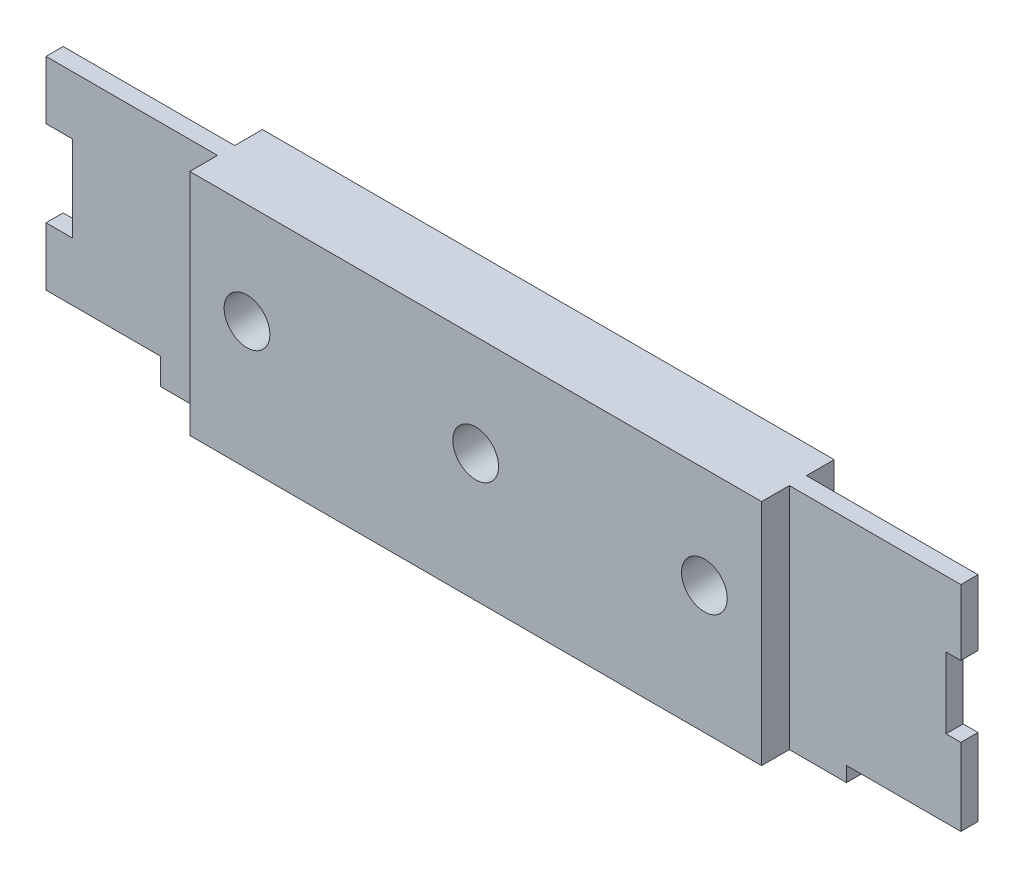
ISO-10303-21;
HEADER;
FILE_DESCRIPTION(('STEP AP214'),'2;1');
FILE_NAME('part.step','',(''),(''),'','','');
FILE_SCHEMA(('AUTOMOTIVE_DESIGN { 1 0 10303 214 1 1 1 1 }'));
ENDSEC;
DATA;
#1=APPLICATION_CONTEXT('core data for automotive mechanical design processes');
#2=APPLICATION_PROTOCOL_DEFINITION('international standard','automotive_design',2000,#1);
#3=PRODUCT_CONTEXT('',#1,'mechanical');
#4=PRODUCT('Part','Part','',(#3));
#5=PRODUCT_RELATED_PRODUCT_CATEGORY('part','',(#4));
#6=PRODUCT_DEFINITION_FORMATION('','',#4);
#7=PRODUCT_DEFINITION_CONTEXT('part definition',#1,'design');
#8=PRODUCT_DEFINITION('design','',#6,#7);
#9=PRODUCT_DEFINITION_SHAPE('','',#8);
#10=(LENGTH_UNIT() NAMED_UNIT(*) SI_UNIT(.MILLI.,.METRE.));
#11=(NAMED_UNIT(*) PLANE_ANGLE_UNIT() SI_UNIT($,.RADIAN.));
#12=(NAMED_UNIT(*) SI_UNIT($,.STERADIAN.) SOLID_ANGLE_UNIT());
#13=UNCERTAINTY_MEASURE_WITH_UNIT(LENGTH_MEASURE(1.E-05),#10,'distance_accuracy_value','');
#14=(GEOMETRIC_REPRESENTATION_CONTEXT(3) GLOBAL_UNCERTAINTY_ASSIGNED_CONTEXT((#13)) GLOBAL_UNIT_ASSIGNED_CONTEXT((#10,
#11,#12)) REPRESENTATION_CONTEXT('',''));
#15=CARTESIAN_POINT('',(0.,0.,0.));
#16=DIRECTION('',(0.,0.,1.));
#17=DIRECTION('',(1.,0.,0.));
#18=AXIS2_PLACEMENT_3D('',#15,#16,#17);
#19=CARTESIAN_POINT('',(0.,0.,0.75));
#20=DIRECTION('',(0.,0.,-1.));
#21=DIRECTION('',(-1.,0.,0.));
#22=AXIS2_PLACEMENT_3D('',#19,#20,#21);
#23=PLANE('',#22);
#24=DIRECTION('',(0.,-1.,0.));
#25=VECTOR('',#24,1.);
#26=CARTESIAN_POINT('',(-25.0000000000001,0.,0.75));
#27=LINE('',#26,#25);
#28=CARTESIAN_POINT('',(-25.0000000000001,8.84999999999999,0.75));
#29=VERTEX_POINT('',#28);
#30=CARTESIAN_POINT('',(-25.0000000000001,-11.15,0.75));
#31=VERTEX_POINT('',#30);
#32=EDGE_CURVE('E218',#29,#31,#27,.T.);
#33=ORIENTED_EDGE('',*,*,#32,.F.);
#34=DIRECTION('',(-1.,0.,0.));
#35=VECTOR('',#34,1.);
#36=CARTESIAN_POINT('',(-40.0000000000001,8.84999999999999,0.75));
#37=LINE('',#36,#35);
#38=CARTESIAN_POINT('',(-40.0000000000001,8.84999999999999,0.75));
#39=VERTEX_POINT('',#38);
#40=EDGE_CURVE('E265',#29,#39,#37,.T.);
#41=ORIENTED_EDGE('',*,*,#40,.T.);
#42=DIRECTION('',(0.,-1.,0.));
#43=VECTOR('',#42,1.);
#44=CARTESIAN_POINT('',(-40.,3.74999999999999,0.75));
#45=LINE('',#44,#43);
#46=CARTESIAN_POINT('',(-40.,3.74999999999999,0.75));
#47=VERTEX_POINT('',#46);
#48=EDGE_CURVE('E233',#39,#47,#45,.T.);
#49=ORIENTED_EDGE('',*,*,#48,.T.);
#50=DIRECTION('',(1.,0.,0.));
#51=VECTOR('',#50,1.);
#52=CARTESIAN_POINT('',(-37.7,3.74999999999999,0.75));
#53=LINE('',#52,#51);
#54=CARTESIAN_POINT('',(-37.7,3.74999999999999,0.75));
#55=VERTEX_POINT('',#54);
#56=EDGE_CURVE('E236',#47,#55,#53,.T.);
#57=ORIENTED_EDGE('',*,*,#56,.T.);
#58=DIRECTION('',(0.,-1.,0.));
#59=VECTOR('',#58,1.);
#60=CARTESIAN_POINT('',(-37.7,-3.75000000000001,0.75));
#61=LINE('',#60,#59);
#62=CARTESIAN_POINT('',(-37.7,-3.75000000000001,0.75));
#63=VERTEX_POINT('',#62);
#64=EDGE_CURVE('E239',#55,#63,#61,.T.);
#65=ORIENTED_EDGE('',*,*,#64,.T.);
#66=DIRECTION('',(-1.,0.,0.));
#67=VECTOR('',#66,1.);
#68=CARTESIAN_POINT('',(-40.,-3.75000000000001,0.75));
#69=LINE('',#68,#67);
#70=CARTESIAN_POINT('',(-40.,-3.75000000000001,0.75));
#71=VERTEX_POINT('',#70);
#72=EDGE_CURVE('E241',#63,#71,#69,.T.);
#73=ORIENTED_EDGE('',*,*,#72,.T.);
#74=DIRECTION('',(0.,-1.,0.));
#75=VECTOR('',#74,1.);
#76=CARTESIAN_POINT('',(-40.,-8.85000000000001,0.75));
#77=LINE('',#76,#75);
#78=CARTESIAN_POINT('',(-40.,-8.85000000000001,0.75));
#79=VERTEX_POINT('',#78);
#80=EDGE_CURVE('E243',#71,#79,#77,.T.);
#81=ORIENTED_EDGE('',*,*,#80,.T.);
#82=DIRECTION('',(1.,0.,0.));
#83=VECTOR('',#82,1.);
#84=CARTESIAN_POINT('',(-30.,-8.85,0.75));
#85=LINE('',#84,#83);
#86=CARTESIAN_POINT('',(-30.,-8.85,0.75));
#87=VERTEX_POINT('',#86);
#88=EDGE_CURVE('E245',#79,#87,#85,.T.);
#89=ORIENTED_EDGE('',*,*,#88,.T.);
#90=DIRECTION('',(0.,-1.,0.));
#91=VECTOR('',#90,1.);
#92=CARTESIAN_POINT('',(-30.,-11.15,0.75));
#93=LINE('',#92,#91);
#94=CARTESIAN_POINT('',(-30.,-11.15,0.75));
#95=VERTEX_POINT('',#94);
#96=EDGE_CURVE('E247',#87,#95,#93,.T.);
#97=ORIENTED_EDGE('',*,*,#96,.T.);
#98=DIRECTION('',(1.,0.,0.));
#99=VECTOR('',#98,1.);
#100=CARTESIAN_POINT('',(30.,-11.15,0.75));
#101=LINE('',#100,#99);
#102=EDGE_CURVE('E56',#95,#31,#101,.T.);
#103=ORIENTED_EDGE('',*,*,#102,.T.);
#104=EDGE_LOOP('',(#33,#41,#49,#57,#65,#73,#81,#89,#97,#103));
#105=FACE_BOUND('',#104,.T.);
#106=ADVANCED_FACE('F33',(#105),#23,.F.);
#107=DIRECTION('',(0.,1.,0.));
#108=VECTOR('',#107,1.);
#109=CARTESIAN_POINT('',(25.,0.,0.75));
#110=LINE('',#109,#108);
#111=CARTESIAN_POINT('',(25.,-11.15,0.75));
#112=VERTEX_POINT('',#111);
#113=CARTESIAN_POINT('',(25.,8.84999999999999,0.75));
#114=VERTEX_POINT('',#113);
#115=EDGE_CURVE('E48',#112,#114,#110,.T.);
#116=ORIENTED_EDGE('',*,*,#115,.F.);
#117=CARTESIAN_POINT('',(30.,-11.15,0.75));
#118=VERTEX_POINT('',#117);
#119=EDGE_CURVE('E249',#112,#118,#101,.T.);
#120=ORIENTED_EDGE('',*,*,#119,.T.);
#121=DIRECTION('',(0.,1.,0.));
#122=VECTOR('',#121,1.);
#123=CARTESIAN_POINT('',(30.,-9.84999999999999,0.75));
#124=LINE('',#123,#122);
#125=CARTESIAN_POINT('',(30.,-9.84999999999999,0.75));
#126=VERTEX_POINT('',#125);
#127=EDGE_CURVE('E251',#118,#126,#124,.T.);
#128=ORIENTED_EDGE('',*,*,#127,.T.);
#129=DIRECTION('',(1.,0.,0.));
#130=VECTOR('',#129,1.);
#131=CARTESIAN_POINT('',(40.,-9.84999999999999,0.75));
#132=LINE('',#131,#130);
#133=CARTESIAN_POINT('',(40.,-9.84999999999999,0.75));
#134=VERTEX_POINT('',#133);
#135=EDGE_CURVE('E253',#126,#134,#132,.T.);
#136=ORIENTED_EDGE('',*,*,#135,.T.);
#137=DIRECTION('',(0.,1.,0.));
#138=VECTOR('',#137,1.);
#139=CARTESIAN_POINT('',(40.,-3.1,0.75));
#140=LINE('',#139,#138);
#141=CARTESIAN_POINT('',(40.,-3.1,0.75));
#142=VERTEX_POINT('',#141);
#143=EDGE_CURVE('E255',#134,#142,#140,.T.);
#144=ORIENTED_EDGE('',*,*,#143,.T.);
#145=DIRECTION('',(-1.,0.,0.));
#146=VECTOR('',#145,1.);
#147=CARTESIAN_POINT('',(38.7,-3.1,0.75));
#148=LINE('',#147,#146);
#149=CARTESIAN_POINT('',(38.7,-3.1,0.75));
#150=VERTEX_POINT('',#149);
#151=EDGE_CURVE('E257',#142,#150,#148,.T.);
#152=ORIENTED_EDGE('',*,*,#151,.T.);
#153=DIRECTION('',(0.,1.,0.));
#154=VECTOR('',#153,1.);
#155=CARTESIAN_POINT('',(38.7,3.1,0.75));
#156=LINE('',#155,#154);
#157=CARTESIAN_POINT('',(38.7,3.1,0.75));
#158=VERTEX_POINT('',#157);
#159=EDGE_CURVE('E259',#150,#158,#156,.T.);
#160=ORIENTED_EDGE('',*,*,#159,.T.);
#161=DIRECTION('',(1.,0.,0.));
#162=VECTOR('',#161,1.);
#163=CARTESIAN_POINT('',(40.,3.1,0.75));
#164=LINE('',#163,#162);
#165=CARTESIAN_POINT('',(40.,3.1,0.75));
#166=VERTEX_POINT('',#165);
#167=EDGE_CURVE('E261',#158,#166,#164,.T.);
#168=ORIENTED_EDGE('',*,*,#167,.T.);
#169=DIRECTION('',(0.,1.,0.));
#170=VECTOR('',#169,1.);
#171=CARTESIAN_POINT('',(40.0000000000001,8.84999999999999,0.75));
#172=LINE('',#171,#170);
#173=CARTESIAN_POINT('',(40.0000000000001,8.84999999999999,0.75));
#174=VERTEX_POINT('',#173);
#175=EDGE_CURVE('E263',#166,#174,#172,.T.);
#176=ORIENTED_EDGE('',*,*,#175,.T.);
#177=EDGE_CURVE('E266',#174,#114,#37,.T.);
#178=ORIENTED_EDGE('',*,*,#177,.T.);
#179=EDGE_LOOP('',(#116,#120,#128,#136,#144,#152,#160,#168,#176,#178));
#180=FACE_BOUND('',#179,.T.);
#181=ADVANCED_FACE('F429',(#180),#23,.F.);
#182=CARTESIAN_POINT('',(0.,0.,-0.75));
#183=DIRECTION('',(0.,0.,-1.));
#184=DIRECTION('',(-1.,0.,0.));
#185=AXIS2_PLACEMENT_3D('',#182,#183,#184);
#186=PLANE('',#185);
#187=DIRECTION('',(-1.,0.,0.));
#188=VECTOR('',#187,1.);
#189=CARTESIAN_POINT('',(-40.0000000000001,8.84999999999999,-0.75));
#190=LINE('',#189,#188);
#191=CARTESIAN_POINT('',(-25.0000000000001,8.84999999999999,-0.75));
#192=VERTEX_POINT('',#191);
#193=CARTESIAN_POINT('',(-40.0000000000001,8.84999999999999,-0.75));
#194=VERTEX_POINT('',#193);
#195=EDGE_CURVE('E301',#192,#194,#190,.T.);
#196=ORIENTED_EDGE('',*,*,#195,.F.);
#197=DIRECTION('',(0.,-1.,0.));
#198=VECTOR('',#197,1.);
#199=CARTESIAN_POINT('',(-25.0000000000001,0.,-0.75));
#200=LINE('',#199,#198);
#201=CARTESIAN_POINT('',(-25.0000000000001,-11.15,-0.75));
#202=VERTEX_POINT('',#201);
#203=EDGE_CURVE('E228',#192,#202,#200,.T.);
#204=ORIENTED_EDGE('',*,*,#203,.T.);
#205=DIRECTION('',(1.,0.,0.));
#206=VECTOR('',#205,1.);
#207=CARTESIAN_POINT('',(30.,-11.15,-0.75));
#208=LINE('',#207,#206);
#209=CARTESIAN_POINT('',(-30.,-11.15,-0.75));
#210=VERTEX_POINT('',#209);
#211=EDGE_CURVE('E284',#210,#202,#208,.T.);
#212=ORIENTED_EDGE('',*,*,#211,.F.);
#213=DIRECTION('',(0.,-1.,0.));
#214=VECTOR('',#213,1.);
#215=CARTESIAN_POINT('',(-30.,-11.15,-0.75));
#216=LINE('',#215,#214);
#217=CARTESIAN_POINT('',(-30.,-8.85,-0.75));
#218=VERTEX_POINT('',#217);
#219=EDGE_CURVE('E281',#218,#210,#216,.T.);
#220=ORIENTED_EDGE('',*,*,#219,.F.);
#221=DIRECTION('',(1.,0.,0.));
#222=VECTOR('',#221,1.);
#223=CARTESIAN_POINT('',(-30.,-8.85,-0.75));
#224=LINE('',#223,#222);
#225=CARTESIAN_POINT('',(-40.,-8.85000000000001,-0.75));
#226=VERTEX_POINT('',#225);
#227=EDGE_CURVE('E279',#226,#218,#224,.T.);
#228=ORIENTED_EDGE('',*,*,#227,.F.);
#229=DIRECTION('',(0.,-1.,0.));
#230=VECTOR('',#229,1.);
#231=CARTESIAN_POINT('',(-40.,-8.85000000000001,-0.75));
#232=LINE('',#231,#230);
#233=CARTESIAN_POINT('',(-40.,-3.75000000000001,-0.75));
#234=VERTEX_POINT('',#233);
#235=EDGE_CURVE('E277',#234,#226,#232,.T.);
#236=ORIENTED_EDGE('',*,*,#235,.F.);
#237=DIRECTION('',(-1.,0.,0.));
#238=VECTOR('',#237,1.);
#239=CARTESIAN_POINT('',(-40.,-3.75000000000001,-0.75));
#240=LINE('',#239,#238);
#241=CARTESIAN_POINT('',(-37.7,-3.75000000000001,-0.75));
#242=VERTEX_POINT('',#241);
#243=EDGE_CURVE('E275',#242,#234,#240,.T.);
#244=ORIENTED_EDGE('',*,*,#243,.F.);
#245=DIRECTION('',(0.,-1.,0.));
#246=VECTOR('',#245,1.);
#247=CARTESIAN_POINT('',(-37.7,-3.75000000000001,-0.75));
#248=LINE('',#247,#246);
#249=CARTESIAN_POINT('',(-37.7,3.74999999999999,-0.75));
#250=VERTEX_POINT('',#249);
#251=EDGE_CURVE('E273',#250,#242,#248,.T.);
#252=ORIENTED_EDGE('',*,*,#251,.F.);
#253=DIRECTION('',(1.,0.,0.));
#254=VECTOR('',#253,1.);
#255=CARTESIAN_POINT('',(-37.7,3.74999999999999,-0.75));
#256=LINE('',#255,#254);
#257=CARTESIAN_POINT('',(-40.,3.74999999999999,-0.75));
#258=VERTEX_POINT('',#257);
#259=EDGE_CURVE('E271',#258,#250,#256,.T.);
#260=ORIENTED_EDGE('',*,*,#259,.F.);
#261=DIRECTION('',(0.,-1.,0.));
#262=VECTOR('',#261,1.);
#263=CARTESIAN_POINT('',(-40.,3.74999999999999,-0.75));
#264=LINE('',#263,#262);
#265=EDGE_CURVE('E232',#194,#258,#264,.T.);
#266=ORIENTED_EDGE('',*,*,#265,.F.);
#267=EDGE_LOOP('',(#196,#204,#212,#220,#228,#236,#244,#252,#260,#266));
#268=FACE_BOUND('',#267,.T.);
#269=ADVANCED_FACE('F355',(#268),#186,.T.);
#270=CARTESIAN_POINT('',(25.,-11.15,-0.75));
#271=VERTEX_POINT('',#270);
#272=CARTESIAN_POINT('',(30.,-11.15,-0.75));
#273=VERTEX_POINT('',#272);
#274=EDGE_CURVE('E283',#271,#273,#208,.T.);
#275=ORIENTED_EDGE('',*,*,#274,.F.);
#276=DIRECTION('',(0.,1.,0.));
#277=VECTOR('',#276,1.);
#278=CARTESIAN_POINT('',(25.,0.,-0.75));
#279=LINE('',#278,#277);
#280=CARTESIAN_POINT('',(25.,8.84999999999999,-0.75));
#281=VERTEX_POINT('',#280);
#282=EDGE_CURVE('E219',#271,#281,#279,.T.);
#283=ORIENTED_EDGE('',*,*,#282,.T.);
#284=CARTESIAN_POINT('',(40.0000000000001,8.84999999999999,-0.75));
#285=VERTEX_POINT('',#284);
#286=EDGE_CURVE('E237',#285,#281,#190,.T.);
#287=ORIENTED_EDGE('',*,*,#286,.F.);
#288=DIRECTION('',(0.,1.,0.));
#289=VECTOR('',#288,1.);
#290=CARTESIAN_POINT('',(40.0000000000001,8.84999999999999,-0.75));
#291=LINE('',#290,#289);
#292=CARTESIAN_POINT('',(40.,3.1,-0.75));
#293=VERTEX_POINT('',#292);
#294=EDGE_CURVE('E299',#293,#285,#291,.T.);
#295=ORIENTED_EDGE('',*,*,#294,.F.);
#296=DIRECTION('',(1.,0.,0.));
#297=VECTOR('',#296,1.);
#298=CARTESIAN_POINT('',(40.,3.1,-0.75));
#299=LINE('',#298,#297);
#300=CARTESIAN_POINT('',(38.7,3.1,-0.75));
#301=VERTEX_POINT('',#300);
#302=EDGE_CURVE('E297',#301,#293,#299,.T.);
#303=ORIENTED_EDGE('',*,*,#302,.F.);
#304=DIRECTION('',(0.,1.,0.));
#305=VECTOR('',#304,1.);
#306=CARTESIAN_POINT('',(38.7,3.1,-0.75));
#307=LINE('',#306,#305);
#308=CARTESIAN_POINT('',(38.7,-3.1,-0.75));
#309=VERTEX_POINT('',#308);
#310=EDGE_CURVE('E295',#309,#301,#307,.T.);
#311=ORIENTED_EDGE('',*,*,#310,.F.);
#312=DIRECTION('',(-1.,0.,0.));
#313=VECTOR('',#312,1.);
#314=CARTESIAN_POINT('',(38.7,-3.1,-0.75));
#315=LINE('',#314,#313);
#316=CARTESIAN_POINT('',(40.,-3.1,-0.75));
#317=VERTEX_POINT('',#316);
#318=EDGE_CURVE('E293',#317,#309,#315,.T.);
#319=ORIENTED_EDGE('',*,*,#318,.F.);
#320=DIRECTION('',(0.,1.,0.));
#321=VECTOR('',#320,1.);
#322=CARTESIAN_POINT('',(40.,-3.1,-0.75));
#323=LINE('',#322,#321);
#324=CARTESIAN_POINT('',(40.,-9.84999999999999,-0.75));
#325=VERTEX_POINT('',#324);
#326=EDGE_CURVE('E291',#325,#317,#323,.T.);
#327=ORIENTED_EDGE('',*,*,#326,.F.);
#328=DIRECTION('',(1.,0.,0.));
#329=VECTOR('',#328,1.);
#330=CARTESIAN_POINT('',(40.,-9.84999999999999,-0.75));
#331=LINE('',#330,#329);
#332=CARTESIAN_POINT('',(30.,-9.84999999999999,-0.75));
#333=VERTEX_POINT('',#332);
#334=EDGE_CURVE('E289',#333,#325,#331,.T.);
#335=ORIENTED_EDGE('',*,*,#334,.F.);
#336=DIRECTION('',(0.,1.,0.));
#337=VECTOR('',#336,1.);
#338=CARTESIAN_POINT('',(30.,-9.84999999999999,-0.75));
#339=LINE('',#338,#337);
#340=EDGE_CURVE('E287',#273,#333,#339,.T.);
#341=ORIENTED_EDGE('',*,*,#340,.F.);
#342=EDGE_LOOP('',(#275,#283,#287,#295,#303,#311,#319,#327,#335,#341));
#343=FACE_BOUND('',#342,.T.);
#344=ADVANCED_FACE('F417',(#343),#186,.T.);
#345=CARTESIAN_POINT('',(-40.,3.74999999999999,0.75));
#346=DIRECTION('',(1.,0.,0.));
#347=DIRECTION('',(0.,1.,0.));
#348=AXIS2_PLACEMENT_3D('',#345,#346,#347);
#349=PLANE('',#348);
#350=ORIENTED_EDGE('',*,*,#265,.T.);
#351=DIRECTION('',(0.,0.,-1.));
#352=VECTOR('',#351,1.);
#353=CARTESIAN_POINT('',(-40.,3.74999999999999,0.75));
#354=LINE('',#353,#352);
#355=EDGE_CURVE('E11',#47,#258,#354,.T.);
#356=ORIENTED_EDGE('',*,*,#355,.F.);
#357=ORIENTED_EDGE('',*,*,#48,.F.);
#358=DIRECTION('',(0.,0.,-1.));
#359=VECTOR('',#358,1.);
#360=CARTESIAN_POINT('',(-40.0000000000001,8.84999999999999,0.75));
#361=LINE('',#360,#359);
#362=EDGE_CURVE('E268',#39,#194,#361,.T.);
#363=ORIENTED_EDGE('',*,*,#362,.T.);
#364=EDGE_LOOP('',(#350,#356,#357,#363));
#365=FACE_BOUND('',#364,.T.);
#366=ADVANCED_FACE('F35',(#365),#349,.F.);
#367=CARTESIAN_POINT('',(-37.7,3.74999999999999,0.75));
#368=DIRECTION('',(0.,1.,0.));
#369=DIRECTION('',(-1.,0.,0.));
#370=AXIS2_PLACEMENT_3D('',#367,#368,#369);
#371=PLANE('',#370);
#372=ORIENTED_EDGE('',*,*,#259,.T.);
#373=DIRECTION('',(0.,0.,-1.));
#374=VECTOR('',#373,1.);
#375=CARTESIAN_POINT('',(-37.7,3.74999999999999,0.75));
#376=LINE('',#375,#374);
#377=EDGE_CURVE('E41',#55,#250,#376,.T.);
#378=ORIENTED_EDGE('',*,*,#377,.F.);
#379=ORIENTED_EDGE('',*,*,#56,.F.);
#380=ORIENTED_EDGE('',*,*,#355,.T.);
#381=EDGE_LOOP('',(#372,#378,#379,#380));
#382=FACE_BOUND('',#381,.T.);
#383=ADVANCED_FACE('F371',(#382),#371,.F.);
#384=CARTESIAN_POINT('',(-37.7,-3.75000000000001,0.75));
#385=DIRECTION('',(1.,0.,0.));
#386=DIRECTION('',(0.,1.,0.));
#387=AXIS2_PLACEMENT_3D('',#384,#385,#386);
#388=PLANE('',#387);
#389=ORIENTED_EDGE('',*,*,#251,.T.);
#390=DIRECTION('',(0.,0.,-1.));
#391=VECTOR('',#390,1.);
#392=CARTESIAN_POINT('',(-37.7,-3.75000000000001,0.75));
#393=LINE('',#392,#391);
#394=EDGE_CURVE('E342',#63,#242,#393,.T.);
#395=ORIENTED_EDGE('',*,*,#394,.F.);
#396=ORIENTED_EDGE('',*,*,#64,.F.);
#397=ORIENTED_EDGE('',*,*,#377,.T.);
#398=EDGE_LOOP('',(#389,#395,#396,#397));
#399=FACE_BOUND('',#398,.T.);
#400=ADVANCED_FACE('F349',(#399),#388,.F.);
#401=CARTESIAN_POINT('',(-40.,-3.75000000000001,0.75));
#402=DIRECTION('',(0.,-1.,0.));
#403=DIRECTION('',(0.,0.,-1.));
#404=AXIS2_PLACEMENT_3D('',#401,#402,#403);
#405=PLANE('',#404);
#406=ORIENTED_EDGE('',*,*,#243,.T.);
#407=DIRECTION('',(0.,0.,-1.));
#408=VECTOR('',#407,1.);
#409=CARTESIAN_POINT('',(-40.,-3.75000000000001,0.75));
#410=LINE('',#409,#408);
#411=EDGE_CURVE('E339',#71,#234,#410,.T.);
#412=ORIENTED_EDGE('',*,*,#411,.F.);
#413=ORIENTED_EDGE('',*,*,#72,.F.);
#414=ORIENTED_EDGE('',*,*,#394,.T.);
#415=EDGE_LOOP('',(#406,#412,#413,#414));
#416=FACE_BOUND('',#415,.T.);
#417=ADVANCED_FACE('F361',(#416),#405,.F.);
#418=CARTESIAN_POINT('',(-40.,-8.85000000000001,0.75));
#419=DIRECTION('',(1.,0.,0.));
#420=DIRECTION('',(0.,1.,0.));
#421=AXIS2_PLACEMENT_3D('',#418,#419,#420);
#422=PLANE('',#421);
#423=ORIENTED_EDGE('',*,*,#235,.T.);
#424=DIRECTION('',(0.,0.,-1.));
#425=VECTOR('',#424,1.);
#426=CARTESIAN_POINT('',(-40.,-8.85000000000001,0.75));
#427=LINE('',#426,#425);
#428=EDGE_CURVE('E336',#79,#226,#427,.T.);
#429=ORIENTED_EDGE('',*,*,#428,.F.);
#430=ORIENTED_EDGE('',*,*,#80,.F.);
#431=ORIENTED_EDGE('',*,*,#411,.T.);
#432=EDGE_LOOP('',(#423,#429,#430,#431));
#433=FACE_BOUND('',#432,.T.);
#434=ADVANCED_FACE('F365',(#433),#422,.F.);
#435=CARTESIAN_POINT('',(-30.,-8.85,0.75));
#436=DIRECTION('',(0.,1.,0.));
#437=DIRECTION('',(-1.,0.,0.));
#438=AXIS2_PLACEMENT_3D('',#435,#436,#437);
#439=PLANE('',#438);
#440=ORIENTED_EDGE('',*,*,#227,.T.);
#441=DIRECTION('',(0.,0.,-1.));
#442=VECTOR('',#441,1.);
#443=CARTESIAN_POINT('',(-30.,-8.85,0.75));
#444=LINE('',#443,#442);
#445=EDGE_CURVE('E333',#87,#218,#444,.T.);
#446=ORIENTED_EDGE('',*,*,#445,.F.);
#447=ORIENTED_EDGE('',*,*,#88,.F.);
#448=ORIENTED_EDGE('',*,*,#428,.T.);
#449=EDGE_LOOP('',(#440,#446,#447,#448));
#450=FACE_BOUND('',#449,.T.);
#451=ADVANCED_FACE('F505',(#450),#439,.F.);
#452=CARTESIAN_POINT('',(-30.,-11.15,0.75));
#453=DIRECTION('',(1.,0.,0.));
#454=DIRECTION('',(0.,1.,0.));
#455=AXIS2_PLACEMENT_3D('',#452,#453,#454);
#456=PLANE('',#455);
#457=ORIENTED_EDGE('',*,*,#219,.T.);
#458=DIRECTION('',(0.,0.,-1.));
#459=VECTOR('',#458,1.);
#460=CARTESIAN_POINT('',(-30.,-11.15,0.75));
#461=LINE('',#460,#459);
#462=EDGE_CURVE('E330',#95,#210,#461,.T.);
#463=ORIENTED_EDGE('',*,*,#462,.F.);
#464=ORIENTED_EDGE('',*,*,#96,.F.);
#465=ORIENTED_EDGE('',*,*,#445,.T.);
#466=EDGE_LOOP('',(#457,#463,#464,#465));
#467=FACE_BOUND('',#466,.T.);
#468=ADVANCED_FACE('F502',(#467),#456,.F.);
#469=CARTESIAN_POINT('',(30.,-11.15,0.75));
#470=DIRECTION('',(0.,1.,0.));
#471=DIRECTION('',(-1.,0.,0.));
#472=AXIS2_PLACEMENT_3D('',#469,#470,#471);
#473=PLANE('',#472);
#474=ORIENTED_EDGE('',*,*,#119,.F.);
#475=DIRECTION('',(0.,0.,-1.));
#476=VECTOR('',#475,1.);
#477=CARTESIAN_POINT('',(25.,-11.15,3.175));
#478=LINE('',#477,#476);
#479=CARTESIAN_POINT('',(25.,-11.15,3.175));
#480=VERTEX_POINT('',#479);
#481=EDGE_CURVE('E201',#480,#112,#478,.T.);
#482=ORIENTED_EDGE('',*,*,#481,.F.);
#483=DIRECTION('',(1.,0.,0.));
#484=VECTOR('',#483,1.);
#485=CARTESIAN_POINT('',(-25.0000000000001,-11.15,3.175));
#486=LINE('',#485,#484);
#487=CARTESIAN_POINT('',(-25.0000000000001,-11.15,3.175));
#488=VERTEX_POINT('',#487);
#489=EDGE_CURVE('E195',#488,#480,#486,.T.);
#490=ORIENTED_EDGE('',*,*,#489,.F.);
#491=DIRECTION('',(0.,0.,-1.));
#492=VECTOR('',#491,1.);
#493=CARTESIAN_POINT('',(-25.0000000000001,-11.15,3.175));
#494=LINE('',#493,#492);
#495=EDGE_CURVE('E199',#488,#31,#494,.T.);
#496=ORIENTED_EDGE('',*,*,#495,.T.);
#497=ORIENTED_EDGE('',*,*,#102,.F.);
#498=ORIENTED_EDGE('',*,*,#462,.T.);
#499=ORIENTED_EDGE('',*,*,#211,.T.);
#500=CARTESIAN_POINT('',(-25.0000000000001,-11.15,-3.175));
#501=VERTEX_POINT('',#500);
#502=EDGE_CURVE('E220',#202,#501,#494,.T.);
#503=ORIENTED_EDGE('',*,*,#502,.T.);
#504=DIRECTION('',(1.,0.,0.));
#505=VECTOR('',#504,1.);
#506=CARTESIAN_POINT('',(-25.0000000000001,-11.15,-3.175));
#507=LINE('',#506,#505);
#508=CARTESIAN_POINT('',(25.,-11.15,-3.175));
#509=VERTEX_POINT('',#508);
#510=EDGE_CURVE('E391',#501,#509,#507,.T.);
#511=ORIENTED_EDGE('',*,*,#510,.T.);
#512=EDGE_CURVE('E407',#271,#509,#478,.T.);
#513=ORIENTED_EDGE('',*,*,#512,.F.);
#514=ORIENTED_EDGE('',*,*,#274,.T.);
#515=DIRECTION('',(0.,0.,-1.));
#516=VECTOR('',#515,1.);
#517=CARTESIAN_POINT('',(30.,-11.15,0.75));
#518=LINE('',#517,#516);
#519=EDGE_CURVE('E327',#118,#273,#518,.T.);
#520=ORIENTED_EDGE('',*,*,#519,.F.);
#521=EDGE_LOOP('',(#474,#482,#490,#496,#497,#498,#499,#503,#511,#513,#514,#520));
#522=FACE_BOUND('',#521,.T.);
#523=ADVANCED_FACE('F197',(#522),#473,.F.);
#524=CARTESIAN_POINT('',(30.,-9.84999999999999,0.75));
#525=DIRECTION('',(-1.,0.,0.));
#526=DIRECTION('',(0.,-1.,0.));
#527=AXIS2_PLACEMENT_3D('',#524,#525,#526);
#528=PLANE('',#527);
#529=ORIENTED_EDGE('',*,*,#340,.T.);
#530=DIRECTION('',(0.,0.,-1.));
#531=VECTOR('',#530,1.);
#532=CARTESIAN_POINT('',(30.,-9.84999999999999,0.75));
#533=LINE('',#532,#531);
#534=EDGE_CURVE('E324',#126,#333,#533,.T.);
#535=ORIENTED_EDGE('',*,*,#534,.F.);
#536=ORIENTED_EDGE('',*,*,#127,.F.);
#537=ORIENTED_EDGE('',*,*,#519,.T.);
#538=EDGE_LOOP('',(#529,#535,#536,#537));
#539=FACE_BOUND('',#538,.T.);
#540=ADVANCED_FACE('F422',(#539),#528,.F.);
#541=CARTESIAN_POINT('',(40.,-9.84999999999999,0.75));
#542=DIRECTION('',(0.,1.,0.));
#543=DIRECTION('',(-1.,0.,0.));
#544=AXIS2_PLACEMENT_3D('',#541,#542,#543);
#545=PLANE('',#544);
#546=ORIENTED_EDGE('',*,*,#334,.T.);
#547=DIRECTION('',(0.,0.,-1.));
#548=VECTOR('',#547,1.);
#549=CARTESIAN_POINT('',(40.,-9.84999999999999,0.75));
#550=LINE('',#549,#548);
#551=EDGE_CURVE('E321',#134,#325,#550,.T.);
#552=ORIENTED_EDGE('',*,*,#551,.F.);
#553=ORIENTED_EDGE('',*,*,#135,.F.);
#554=ORIENTED_EDGE('',*,*,#534,.T.);
#555=EDGE_LOOP('',(#546,#552,#553,#554));
#556=FACE_BOUND('',#555,.T.);
#557=ADVANCED_FACE('F426',(#556),#545,.F.);
#558=CARTESIAN_POINT('',(40.,-3.1,0.75));
#559=DIRECTION('',(-1.,0.,0.));
#560=DIRECTION('',(0.,-1.,0.));
#561=AXIS2_PLACEMENT_3D('',#558,#559,#560);
#562=PLANE('',#561);
#563=ORIENTED_EDGE('',*,*,#326,.T.);
#564=DIRECTION('',(0.,0.,-1.));
#565=VECTOR('',#564,1.);
#566=CARTESIAN_POINT('',(40.,-3.1,0.75));
#567=LINE('',#566,#565);
#568=EDGE_CURVE('E318',#142,#317,#567,.T.);
#569=ORIENTED_EDGE('',*,*,#568,.F.);
#570=ORIENTED_EDGE('',*,*,#143,.F.);
#571=ORIENTED_EDGE('',*,*,#551,.T.);
#572=EDGE_LOOP('',(#563,#569,#570,#571));
#573=FACE_BOUND('',#572,.T.);
#574=ADVANCED_FACE('F491',(#573),#562,.F.);
#575=CARTESIAN_POINT('',(38.7,-3.1,0.75));
#576=DIRECTION('',(0.,-1.,0.));
#577=DIRECTION('',(0.,0.,-1.));
#578=AXIS2_PLACEMENT_3D('',#575,#576,#577);
#579=PLANE('',#578);
#580=ORIENTED_EDGE('',*,*,#318,.T.);
#581=DIRECTION('',(0.,0.,-1.));
#582=VECTOR('',#581,1.);
#583=CARTESIAN_POINT('',(38.7,-3.1,0.75));
#584=LINE('',#583,#582);
#585=EDGE_CURVE('E315',#150,#309,#584,.T.);
#586=ORIENTED_EDGE('',*,*,#585,.F.);
#587=ORIENTED_EDGE('',*,*,#151,.F.);
#588=ORIENTED_EDGE('',*,*,#568,.T.);
#589=EDGE_LOOP('',(#580,#586,#587,#588));
#590=FACE_BOUND('',#589,.T.);
#591=ADVANCED_FACE('F487',(#590),#579,.F.);
#592=CARTESIAN_POINT('',(38.7,3.1,0.75));
#593=DIRECTION('',(-1.,0.,0.));
#594=DIRECTION('',(0.,0.,1.));
#595=AXIS2_PLACEMENT_3D('',#592,#593,#594);
#596=PLANE('',#595);
#597=ORIENTED_EDGE('',*,*,#310,.T.);
#598=DIRECTION('',(0.,0.,-1.));
#599=VECTOR('',#598,1.);
#600=CARTESIAN_POINT('',(38.7,3.1,0.75));
#601=LINE('',#600,#599);
#602=EDGE_CURVE('E312',#158,#301,#601,.T.);
#603=ORIENTED_EDGE('',*,*,#602,.F.);
#604=ORIENTED_EDGE('',*,*,#159,.F.);
#605=ORIENTED_EDGE('',*,*,#585,.T.);
#606=EDGE_LOOP('',(#597,#603,#604,#605));
#607=FACE_BOUND('',#606,.T.);
#608=ADVANCED_FACE('F483',(#607),#596,.F.);
#609=CARTESIAN_POINT('',(40.,3.1,0.75));
#610=DIRECTION('',(0.,1.,0.));
#611=DIRECTION('',(0.,0.,1.));
#612=AXIS2_PLACEMENT_3D('',#609,#610,#611);
#613=PLANE('',#612);
#614=ORIENTED_EDGE('',*,*,#302,.T.);
#615=DIRECTION('',(0.,0.,-1.));
#616=VECTOR('',#615,1.);
#617=CARTESIAN_POINT('',(40.,3.1,0.75));
#618=LINE('',#617,#616);
#619=EDGE_CURVE('E309',#166,#293,#618,.T.);
#620=ORIENTED_EDGE('',*,*,#619,.F.);
#621=ORIENTED_EDGE('',*,*,#167,.F.);
#622=ORIENTED_EDGE('',*,*,#602,.T.);
#623=EDGE_LOOP('',(#614,#620,#621,#622));
#624=FACE_BOUND('',#623,.T.);
#625=ADVANCED_FACE('F479',(#624),#613,.F.);
#626=CARTESIAN_POINT('',(40.0000000000001,8.84999999999999,0.75));
#627=DIRECTION('',(-1.,0.,0.));
#628=DIRECTION('',(0.,-1.,0.));
#629=AXIS2_PLACEMENT_3D('',#626,#627,#628);
#630=PLANE('',#629);
#631=ORIENTED_EDGE('',*,*,#294,.T.);
#632=DIRECTION('',(0.,0.,-1.));
#633=VECTOR('',#632,1.);
#634=CARTESIAN_POINT('',(40.0000000000001,8.84999999999999,0.75));
#635=LINE('',#634,#633);
#636=EDGE_CURVE('E306',#174,#285,#635,.T.);
#637=ORIENTED_EDGE('',*,*,#636,.F.);
#638=ORIENTED_EDGE('',*,*,#175,.F.);
#639=ORIENTED_EDGE('',*,*,#619,.T.);
#640=EDGE_LOOP('',(#631,#637,#638,#639));
#641=FACE_BOUND('',#640,.T.);
#642=ADVANCED_FACE('F476',(#641),#630,.F.);
#643=CARTESIAN_POINT('',(-40.0000000000001,8.84999999999999,0.75));
#644=DIRECTION('',(0.,-1.,0.));
#645=DIRECTION('',(0.,0.,-1.));
#646=AXIS2_PLACEMENT_3D('',#643,#644,#645);
#647=PLANE('',#646);
#648=ORIENTED_EDGE('',*,*,#286,.T.);
#649=DIRECTION('',(0.,0.,-1.));
#650=VECTOR('',#649,1.);
#651=CARTESIAN_POINT('',(25.,8.84999999999999,3.175));
#652=LINE('',#651,#650);
#653=CARTESIAN_POINT('',(25.,8.84999999999999,-3.175));
#654=VERTEX_POINT('',#653);
#655=EDGE_CURVE('E404',#281,#654,#652,.T.);
#656=ORIENTED_EDGE('',*,*,#655,.T.);
#657=DIRECTION('',(-1.,0.,0.));
#658=VECTOR('',#657,1.);
#659=CARTESIAN_POINT('',(-25.0000000000001,8.84999999999999,-3.175));
#660=LINE('',#659,#658);
#661=CARTESIAN_POINT('',(-25.0000000000001,8.84999999999999,-3.175));
#662=VERTEX_POINT('',#661);
#663=EDGE_CURVE('E215',#654,#662,#660,.T.);
#664=ORIENTED_EDGE('',*,*,#663,.T.);
#665=DIRECTION('',(0.,0.,-1.));
#666=VECTOR('',#665,1.);
#667=CARTESIAN_POINT('',(-25.0000000000001,8.84999999999999,3.175));
#668=LINE('',#667,#666);
#669=EDGE_CURVE('E379',#192,#662,#668,.T.);
#670=ORIENTED_EDGE('',*,*,#669,.F.);
#671=ORIENTED_EDGE('',*,*,#195,.T.);
#672=ORIENTED_EDGE('',*,*,#362,.F.);
#673=ORIENTED_EDGE('',*,*,#40,.F.);
#674=CARTESIAN_POINT('',(-25.0000000000001,8.84999999999999,3.175));
#675=VERTEX_POINT('',#674);
#676=EDGE_CURVE('E384',#675,#29,#668,.T.);
#677=ORIENTED_EDGE('',*,*,#676,.F.);
#678=DIRECTION('',(-1.,0.,0.));
#679=VECTOR('',#678,1.);
#680=CARTESIAN_POINT('',(-25.0000000000001,8.84999999999999,3.175));
#681=LINE('',#680,#679);
#682=CARTESIAN_POINT('',(25.,8.84999999999999,3.175));
#683=VERTEX_POINT('',#682);
#684=EDGE_CURVE('E211',#683,#675,#681,.T.);
#685=ORIENTED_EDGE('',*,*,#684,.F.);
#686=EDGE_CURVE('E405',#683,#114,#652,.T.);
#687=ORIENTED_EDGE('',*,*,#686,.T.);
#688=ORIENTED_EDGE('',*,*,#177,.F.);
#689=ORIENTED_EDGE('',*,*,#636,.T.);
#690=EDGE_LOOP('',(#648,#656,#664,#670,#671,#672,#673,#677,#685,#687,#688,#689));
#691=FACE_BOUND('',#690,.T.);
#692=ADVANCED_FACE('F377',(#691),#647,.F.);
#693=CARTESIAN_POINT('',(25.,8.84999999999999,3.175));
#694=DIRECTION('',(-1.,0.,0.));
#695=DIRECTION('',(0.,0.,1.));
#696=AXIS2_PLACEMENT_3D('',#693,#694,#695);
#697=PLANE('',#696);
#698=ORIENTED_EDGE('',*,*,#282,.F.);
#699=ORIENTED_EDGE('',*,*,#512,.T.);
#700=DIRECTION('',(0.,1.,0.));
#701=VECTOR('',#700,1.);
#702=CARTESIAN_POINT('',(25.,8.84999999999999,-3.175));
#703=LINE('',#702,#701);
#704=EDGE_CURVE('E397',#509,#654,#703,.T.);
#705=ORIENTED_EDGE('',*,*,#704,.T.);
#706=ORIENTED_EDGE('',*,*,#655,.F.);
#707=EDGE_LOOP('',(#698,#699,#705,#706));
#708=FACE_BOUND('',#707,.T.);
#709=ADVANCED_FACE('F412',(#708),#697,.F.);
#710=CARTESIAN_POINT('',(-25.0000000000001,8.84999999999999,3.175));
#711=DIRECTION('',(1.,0.,0.));
#712=DIRECTION('',(0.,1.,0.));
#713=AXIS2_PLACEMENT_3D('',#710,#711,#712);
#714=PLANE('',#713);
#715=ORIENTED_EDGE('',*,*,#203,.F.);
#716=ORIENTED_EDGE('',*,*,#669,.T.);
#717=DIRECTION('',(0.,-1.,0.));
#718=VECTOR('',#717,1.);
#719=CARTESIAN_POINT('',(-25.0000000000001,8.84999999999999,-3.175));
#720=LINE('',#719,#718);
#721=EDGE_CURVE('E387',#662,#501,#720,.T.);
#722=ORIENTED_EDGE('',*,*,#721,.T.);
#723=ORIENTED_EDGE('',*,*,#502,.F.);
#724=EDGE_LOOP('',(#715,#716,#722,#723));
#725=FACE_BOUND('',#724,.T.);
#726=ADVANCED_FACE('F386',(#725),#714,.F.);
#727=CARTESIAN_POINT('',(0.,0.,-3.175));
#728=DIRECTION('',(0.,0.,1.));
#729=DIRECTION('',(1.,0.,0.));
#730=AXIS2_PLACEMENT_3D('',#727,#728,#729);
#731=PLANE('',#730);
#732=ORIENTED_EDGE('',*,*,#721,.F.);
#733=ORIENTED_EDGE('',*,*,#663,.F.);
#734=ORIENTED_EDGE('',*,*,#704,.F.);
#735=ORIENTED_EDGE('',*,*,#510,.F.);
#736=EDGE_LOOP('',(#732,#733,#734,#735));
#737=FACE_BOUND('',#736,.T.);
#738=CARTESIAN_POINT('',(-20.,0.,-3.175));
#739=DIRECTION('',(0.,0.,1.));
#740=DIRECTION('',(1.,0.,0.));
#741=AXIS2_PLACEMENT_3D('',#738,#739,#740);
#742=CIRCLE('',#741,2.00000000000003);
#743=CARTESIAN_POINT('',(-18.,0.,-3.175));
#744=VERTEX_POINT('',#743);
#745=EDGE_CURVE('E435',#744,#744,#742,.T.);
#746=ORIENTED_EDGE('',*,*,#745,.T.);
#747=EDGE_LOOP('',(#746));
#748=FACE_BOUND('',#747,.T.);
#749=CARTESIAN_POINT('',(0.,0.,-3.175));
#750=DIRECTION('',(0.,0.,1.));
#751=DIRECTION('',(1.,0.,0.));
#752=AXIS2_PLACEMENT_3D('',#749,#750,#751);
#753=CIRCLE('',#752,2.00000000000002);
#754=CARTESIAN_POINT('',(2.00000000000002,0.,-3.175));
#755=VERTEX_POINT('',#754);
#756=EDGE_CURVE('E441',#755,#755,#753,.T.);
#757=ORIENTED_EDGE('',*,*,#756,.T.);
#758=EDGE_LOOP('',(#757));
#759=FACE_BOUND('',#758,.T.);
#760=CARTESIAN_POINT('',(20.,0.,-3.175));
#761=DIRECTION('',(0.,0.,1.));
#762=DIRECTION('',(1.,0.,0.));
#763=AXIS2_PLACEMENT_3D('',#760,#761,#762);
#764=CIRCLE('',#763,2.00000000000003);
#765=CARTESIAN_POINT('',(22.,0.,-3.175));
#766=VERTEX_POINT('',#765);
#767=EDGE_CURVE('E447',#766,#766,#764,.T.);
#768=ORIENTED_EDGE('',*,*,#767,.T.);
#769=EDGE_LOOP('',(#768));
#770=FACE_BOUND('',#769,.T.);
#771=ADVANCED_FACE('F394',(#737,#748,#759,#770),#731,.F.);
#772=CARTESIAN_POINT('',(20.,0.,0.75));
#773=DIRECTION('',(0.,0.,-1.));
#774=DIRECTION('',(-1.,0.,0.));
#775=AXIS2_PLACEMENT_3D('',#772,#773,#774);
#776=CYLINDRICAL_SURFACE('',#775,2.00000000000003);
#777=ORIENTED_EDGE('',*,*,#767,.F.);
#778=EDGE_LOOP('',(#777));
#779=FACE_BOUND('',#778,.T.);
#780=CARTESIAN_POINT('',(20.,0.,3.175));
#781=DIRECTION('',(0.,0.,1.));
#782=DIRECTION('',(1.,0.,0.));
#783=AXIS2_PLACEMENT_3D('',#780,#781,#782);
#784=CIRCLE('',#783,2.00000000000003);
#785=CARTESIAN_POINT('',(22.,0.,3.175));
#786=VERTEX_POINT('',#785);
#787=EDGE_CURVE('E444',#786,#786,#784,.T.);
#788=ORIENTED_EDGE('',*,*,#787,.T.);
#789=EDGE_LOOP('',(#788));
#790=FACE_BOUND('',#789,.T.);
#791=ADVANCED_FACE('F453',(#779,#790),#776,.F.);
#792=CARTESIAN_POINT('',(0.,0.,0.75));
#793=DIRECTION('',(0.,0.,-1.));
#794=DIRECTION('',(-1.,0.,0.));
#795=AXIS2_PLACEMENT_3D('',#792,#793,#794);
#796=CYLINDRICAL_SURFACE('',#795,2.00000000000002);
#797=ORIENTED_EDGE('',*,*,#756,.F.);
#798=EDGE_LOOP('',(#797));
#799=FACE_BOUND('',#798,.T.);
#800=CARTESIAN_POINT('',(0.,0.,3.175));
#801=DIRECTION('',(0.,0.,1.));
#802=DIRECTION('',(1.,0.,0.));
#803=AXIS2_PLACEMENT_3D('',#800,#801,#802);
#804=CIRCLE('',#803,2.00000000000002);
#805=CARTESIAN_POINT('',(2.00000000000002,0.,3.175));
#806=VERTEX_POINT('',#805);
#807=EDGE_CURVE('E438',#806,#806,#804,.T.);
#808=ORIENTED_EDGE('',*,*,#807,.T.);
#809=EDGE_LOOP('',(#808));
#810=FACE_BOUND('',#809,.T.);
#811=ADVANCED_FACE('F661',(#799,#810),#796,.F.);
#812=CARTESIAN_POINT('',(-20.,0.,0.75));
#813=DIRECTION('',(0.,0.,-1.));
#814=DIRECTION('',(-1.,0.,0.));
#815=AXIS2_PLACEMENT_3D('',#812,#813,#814);
#816=CYLINDRICAL_SURFACE('',#815,2.00000000000003);
#817=ORIENTED_EDGE('',*,*,#745,.F.);
#818=EDGE_LOOP('',(#817));
#819=FACE_BOUND('',#818,.T.);
#820=CARTESIAN_POINT('',(-20.,0.,3.175));
#821=DIRECTION('',(0.,0.,1.));
#822=DIRECTION('',(1.,0.,0.));
#823=AXIS2_PLACEMENT_3D('',#820,#821,#822);
#824=CIRCLE('',#823,2.00000000000003);
#825=CARTESIAN_POINT('',(-18.,0.,3.175));
#826=VERTEX_POINT('',#825);
#827=EDGE_CURVE('E400',#826,#826,#824,.T.);
#828=ORIENTED_EDGE('',*,*,#827,.T.);
#829=EDGE_LOOP('',(#828));
#830=FACE_BOUND('',#829,.T.);
#831=ADVANCED_FACE('F671',(#819,#830),#816,.F.);
#832=ORIENTED_EDGE('',*,*,#676,.T.);
#833=ORIENTED_EDGE('',*,*,#32,.T.);
#834=ORIENTED_EDGE('',*,*,#495,.F.);
#835=DIRECTION('',(0.,-1.,0.));
#836=VECTOR('',#835,1.);
#837=CARTESIAN_POINT('',(-25.0000000000001,8.84999999999999,3.175));
#838=LINE('',#837,#836);
#839=EDGE_CURVE('E205',#675,#488,#838,.T.);
#840=ORIENTED_EDGE('',*,*,#839,.F.);
#841=EDGE_LOOP('',(#832,#833,#834,#840));
#842=FACE_BOUND('',#841,.T.);
#843=ADVANCED_FACE('F217',(#842),#714,.F.);
#844=ORIENTED_EDGE('',*,*,#481,.T.);
#845=ORIENTED_EDGE('',*,*,#115,.T.);
#846=ORIENTED_EDGE('',*,*,#686,.F.);
#847=DIRECTION('',(0.,1.,0.));
#848=VECTOR('',#847,1.);
#849=CARTESIAN_POINT('',(25.,8.84999999999999,3.175));
#850=LINE('',#849,#848);
#851=EDGE_CURVE('E204',#480,#683,#850,.T.);
#852=ORIENTED_EDGE('',*,*,#851,.F.);
#853=EDGE_LOOP('',(#844,#845,#846,#852));
#854=FACE_BOUND('',#853,.T.);
#855=ADVANCED_FACE('F432',(#854),#697,.F.);
#856=CARTESIAN_POINT('',(0.,0.,3.175));
#857=DIRECTION('',(0.,0.,1.));
#858=DIRECTION('',(1.,0.,0.));
#859=AXIS2_PLACEMENT_3D('',#856,#857,#858);
#860=PLANE('',#859);
#861=ORIENTED_EDGE('',*,*,#807,.F.);
#862=EDGE_LOOP('',(#861));
#863=FACE_BOUND('',#862,.T.);
#864=ORIENTED_EDGE('',*,*,#839,.T.);
#865=ORIENTED_EDGE('',*,*,#489,.T.);
#866=ORIENTED_EDGE('',*,*,#851,.T.);
#867=ORIENTED_EDGE('',*,*,#684,.T.);
#868=EDGE_LOOP('',(#864,#865,#866,#867));
#869=FACE_BOUND('',#868,.T.);
#870=ORIENTED_EDGE('',*,*,#827,.F.);
#871=EDGE_LOOP('',(#870));
#872=FACE_BOUND('',#871,.T.);
#873=ORIENTED_EDGE('',*,*,#787,.F.);
#874=EDGE_LOOP('',(#873));
#875=FACE_BOUND('',#874,.T.);
#876=ADVANCED_FACE('F208',(#863,#869,#872,#875),#860,.T.);
#877=CLOSED_SHELL('',(#106,#181,#269,#344,#366,#383,#400,#417,#434,#451,#468,#523,#540,#557,
#574,#591,#608,#625,#642,#692,#709,#726,#771,#791,#811,#831,#843,#855,#876));
#878=MANIFOLD_SOLID_BREP('B2',#877);
#879=ADVANCED_BREP_SHAPE_REPRESENTATION('',(#18,#878),#14);
#880=SHAPE_DEFINITION_REPRESENTATION(#9,#879);
ENDSEC;
END-ISO-10303-21;
